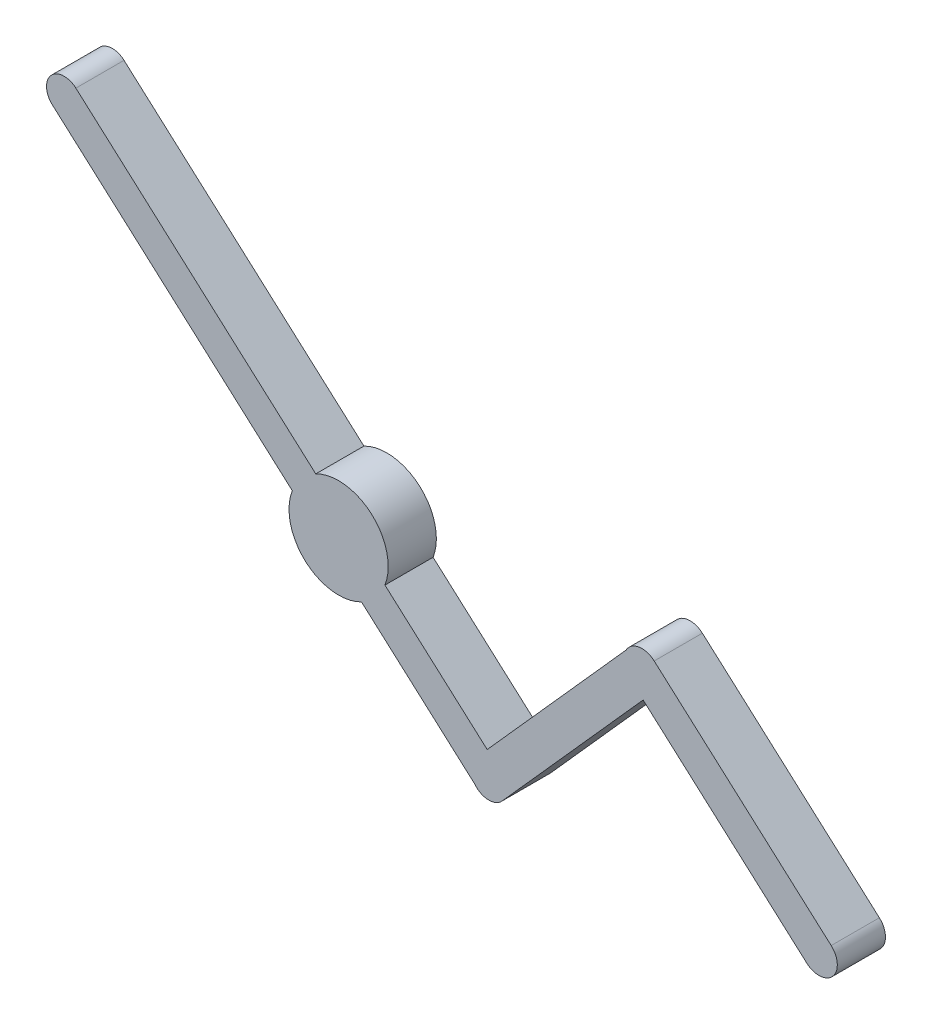
ISO-10303-21;
HEADER;
FILE_DESCRIPTION(('STEP AP214'),'2;1');
FILE_NAME('part.step','',(''),(''),'','','');
FILE_SCHEMA(('AUTOMOTIVE_DESIGN { 1 0 10303 214 1 1 1 1 }'));
ENDSEC;
DATA;
#1=APPLICATION_CONTEXT('core data for automotive mechanical design processes');
#2=APPLICATION_PROTOCOL_DEFINITION('international standard','automotive_design',2000,#1);
#3=PRODUCT_CONTEXT('',#1,'mechanical');
#4=PRODUCT('Part','Part','',(#3));
#5=PRODUCT_RELATED_PRODUCT_CATEGORY('part','',(#4));
#6=PRODUCT_DEFINITION_FORMATION('','',#4);
#7=PRODUCT_DEFINITION_CONTEXT('part definition',#1,'design');
#8=PRODUCT_DEFINITION('design','',#6,#7);
#9=PRODUCT_DEFINITION_SHAPE('','',#8);
#10=(LENGTH_UNIT() NAMED_UNIT(*) SI_UNIT(.MILLI.,.METRE.));
#11=(NAMED_UNIT(*) PLANE_ANGLE_UNIT() SI_UNIT($,.RADIAN.));
#12=(NAMED_UNIT(*) SI_UNIT($,.STERADIAN.) SOLID_ANGLE_UNIT());
#13=UNCERTAINTY_MEASURE_WITH_UNIT(LENGTH_MEASURE(1.E-05),#10,'distance_accuracy_value','');
#14=(GEOMETRIC_REPRESENTATION_CONTEXT(3) GLOBAL_UNCERTAINTY_ASSIGNED_CONTEXT((#13)) GLOBAL_UNIT_ASSIGNED_CONTEXT((#10,
#11,#12)) REPRESENTATION_CONTEXT('',''));
#15=CARTESIAN_POINT('',(0.,0.,0.));
#16=DIRECTION('',(0.,0.,1.));
#17=DIRECTION('',(1.,0.,0.));
#18=AXIS2_PLACEMENT_3D('',#15,#16,#17);
#19=CARTESIAN_POINT('',(144.167279134353,-128.666791198798,2.));
#20=DIRECTION('',(-0.746076463848962,0.665860278204541,0.));
#21=DIRECTION('',(-0.665860278204541,-0.746076463848962,0.));
#22=AXIS2_PLACEMENT_3D('',#19,#20,#21);
#23=PLANE('',#22);
#24=DIRECTION('',(0.665860278204541,0.746076463848962,0.));
#25=VECTOR('',#24,1.);
#26=CARTESIAN_POINT('',(144.167279134353,-128.666791198798,0.));
#27=LINE('',#26,#25);
#28=CARTESIAN_POINT('',(197.074273983325,-69.3860908449162,0.));
#29=VERTEX_POINT('',#28);
#30=CARTESIAN_POINT('',(202.925750043493,-62.8296874819783,0.));
#31=VERTEX_POINT('',#30);
#32=EDGE_CURVE('E169',#29,#31,#27,.T.);
#33=ORIENTED_EDGE('',*,*,#32,.T.);
#34=DIRECTION('',(0.,0.,-1.));
#35=VECTOR('',#34,1.);
#36=CARTESIAN_POINT('',(202.925750043493,-62.8296874819783,2.));
#37=LINE('',#36,#35);
#38=CARTESIAN_POINT('',(202.925750043493,-62.8296874819783,2.));
#39=VERTEX_POINT('',#38);
#40=EDGE_CURVE('E11',#39,#31,#37,.T.);
#41=ORIENTED_EDGE('',*,*,#40,.F.);
#42=DIRECTION('',(0.665860278204541,0.746076463848962,0.));
#43=VECTOR('',#42,1.);
#44=CARTESIAN_POINT('',(144.167279134353,-128.666791198798,2.));
#45=LINE('',#44,#43);
#46=CARTESIAN_POINT('',(197.074273983325,-69.3860908449162,2.));
#47=VERTEX_POINT('',#46);
#48=EDGE_CURVE('E202',#47,#39,#45,.T.);
#49=ORIENTED_EDGE('',*,*,#48,.F.);
#50=DIRECTION('',(0.,0.,-1.));
#51=VECTOR('',#50,1.);
#52=CARTESIAN_POINT('',(197.074273983325,-69.3860908449162,2.));
#53=LINE('',#52,#51);
#54=EDGE_CURVE('E165',#47,#29,#53,.T.);
#55=ORIENTED_EDGE('',*,*,#54,.T.);
#56=EDGE_LOOP('',(#33,#41,#49,#55));
#57=FACE_BOUND('',#56,.T.);
#58=ADVANCED_FACE('F37',(#57),#23,.F.);
#59=CARTESIAN_POINT('',(58.7584709091406,65.8371037168205,2.));
#60=DIRECTION('',(0.665860278204545,0.746076463848959,0.));
#61=DIRECTION('',(-0.746076463848959,0.665860278204545,0.));
#62=AXIS2_PLACEMENT_3D('',#59,#60,#61);
#63=PLANE('',#62);
#64=DIRECTION('',(0.746076463848959,-0.665860278204544,0.));
#65=VECTOR('',#64,1.);
#66=CARTESIAN_POINT('',(58.7584709091406,65.8371037168205,0.));
#67=LINE('',#66,#65);
#68=CARTESIAN_POINT('',(209.719946290777,-68.8933895589126,0.));
#69=VERTEX_POINT('',#68);
#70=EDGE_CURVE('E172',#31,#69,#67,.T.);
#71=ORIENTED_EDGE('',*,*,#70,.T.);
#72=DIRECTION('',(0.,0.,-1.));
#73=VECTOR('',#72,1.);
#74=CARTESIAN_POINT('',(209.719946290777,-68.8933895589126,2.));
#75=LINE('',#74,#73);
#76=CARTESIAN_POINT('',(209.719946290777,-68.8933895589126,2.));
#77=VERTEX_POINT('',#76);
#78=EDGE_CURVE('E45',#77,#69,#75,.T.);
#79=ORIENTED_EDGE('',*,*,#78,.F.);
#80=DIRECTION('',(0.746076463848959,-0.665860278204544,0.));
#81=VECTOR('',#80,1.);
#82=CARTESIAN_POINT('',(58.7584709091406,65.8371037168205,2.));
#83=LINE('',#82,#81);
#84=EDGE_CURVE('E114',#39,#77,#83,.T.);
#85=ORIENTED_EDGE('',*,*,#84,.F.);
#86=ORIENTED_EDGE('',*,*,#40,.T.);
#87=EDGE_LOOP('',(#71,#79,#85,#86));
#88=FACE_BOUND('',#87,.T.);
#89=ADVANCED_FACE('F281',(#88),#63,.F.);
#90=CARTESIAN_POINT('',(210.227354136381,-68.3248542917263,2.));
#91=DIRECTION('',(0.,0.,-1.));
#92=DIRECTION('',(-1.,0.,0.));
#93=AXIS2_PLACEMENT_3D('',#90,#91,#92);
#94=CYLINDRICAL_SURFACE('',#93,0.762033510953083);
#95=CARTESIAN_POINT('',(210.227354136381,-68.3248542917263,0.));
#96=DIRECTION('',(0.,0.,1.));
#97=DIRECTION('',(1.,0.,0.));
#98=AXIS2_PLACEMENT_3D('',#95,#96,#97);
#99=CIRCLE('',#98,0.762033510953083);
#100=CARTESIAN_POINT('',(210.734761981986,-67.75631902454,0.));
#101=VERTEX_POINT('',#100);
#102=EDGE_CURVE('E174',#69,#101,#99,.T.);
#103=ORIENTED_EDGE('',*,*,#102,.T.);
#104=DIRECTION('',(0.,0.,-1.));
#105=VECTOR('',#104,1.);
#106=CARTESIAN_POINT('',(210.734761981986,-67.75631902454,2.));
#107=LINE('',#106,#105);
#108=CARTESIAN_POINT('',(210.734761981986,-67.75631902454,2.));
#109=VERTEX_POINT('',#108);
#110=EDGE_CURVE('E221',#109,#101,#107,.T.);
#111=ORIENTED_EDGE('',*,*,#110,.F.);
#112=CARTESIAN_POINT('',(210.227354136381,-68.3248542917263,2.));
#113=DIRECTION('',(0.,0.,1.));
#114=DIRECTION('',(1.,0.,0.));
#115=AXIS2_PLACEMENT_3D('',#112,#113,#114);
#116=CIRCLE('',#115,0.762033510953083);
#117=EDGE_CURVE('E228',#77,#109,#116,.T.);
#118=ORIENTED_EDGE('',*,*,#117,.F.);
#119=ORIENTED_EDGE('',*,*,#78,.T.);
#120=EDGE_LOOP('',(#103,#111,#118,#119));
#121=FACE_BOUND('',#120,.T.);
#122=ADVANCED_FACE('F226',(#121),#94,.T.);
#123=CARTESIAN_POINT('',(59.7732866003492,66.974174251193,2.));
#124=DIRECTION('',(0.665860278204544,0.74607646384896,0.));
#125=DIRECTION('',(-0.74607646384896,0.665860278204544,0.));
#126=AXIS2_PLACEMENT_3D('',#123,#124,#125);
#127=PLANE('',#126);
#128=DIRECTION('',(0.74607646384896,-0.665860278204544,0.));
#129=VECTOR('',#128,1.);
#130=CARTESIAN_POINT('',(59.7732866003492,66.974174251193,0.));
#131=LINE('',#130,#129);
#132=CARTESIAN_POINT('',(203.385396716601,-61.1971382470234,0.));
#133=VERTEX_POINT('',#132);
#134=EDGE_CURVE('E177',#133,#101,#131,.T.);
#135=ORIENTED_EDGE('',*,*,#134,.F.);
#136=DIRECTION('',(0.,0.,-1.));
#137=VECTOR('',#136,1.);
#138=CARTESIAN_POINT('',(203.385396716601,-61.1971382470234,2.));
#139=LINE('',#138,#137);
#140=CARTESIAN_POINT('',(203.385396716601,-61.1971382470234,2.));
#141=VERTEX_POINT('',#140);
#142=EDGE_CURVE('E219',#141,#133,#139,.T.);
#143=ORIENTED_EDGE('',*,*,#142,.F.);
#144=DIRECTION('',(0.74607646384896,-0.665860278204544,0.));
#145=VECTOR('',#144,1.);
#146=CARTESIAN_POINT('',(59.7732866003492,66.974174251193,2.));
#147=LINE('',#146,#145);
#148=EDGE_CURVE('E239',#141,#109,#147,.T.);
#149=ORIENTED_EDGE('',*,*,#148,.T.);
#150=ORIENTED_EDGE('',*,*,#110,.T.);
#151=EDGE_LOOP('',(#135,#143,#149,#150));
#152=FACE_BOUND('',#151,.T.);
#153=ADVANCED_FACE('F235',(#152),#127,.T.);
#154=CARTESIAN_POINT('',(202.877988870997,-61.7656735142097,2.));
#155=DIRECTION('',(0.,0.,-1.));
#156=DIRECTION('',(-1.,0.,0.));
#157=AXIS2_PLACEMENT_3D('',#154,#155,#156);
#158=CYLINDRICAL_SURFACE('',#157,0.762033510953078);
#159=CARTESIAN_POINT('',(202.877988870997,-61.7656735142097,0.));
#160=DIRECTION('',(0.,0.,1.));
#161=DIRECTION('',(1.,0.,0.));
#162=AXIS2_PLACEMENT_3D('',#159,#160,#161);
#163=CIRCLE('',#162,0.762033510953078);
#164=CARTESIAN_POINT('',(202.213441705855,-61.3927497457028,0.));
#165=VERTEX_POINT('',#164);
#166=EDGE_CURVE('E180',#133,#165,#163,.T.);
#167=ORIENTED_EDGE('',*,*,#166,.T.);
#168=DIRECTION('',(0.,0.,-1.));
#169=VECTOR('',#168,1.);
#170=CARTESIAN_POINT('',(202.213441705855,-61.3927497457028,2.));
#171=LINE('',#170,#169);
#172=CARTESIAN_POINT('',(202.213441705855,-61.3927497457028,2.));
#173=VERTEX_POINT('',#172);
#174=EDGE_CURVE('E217',#173,#165,#171,.T.);
#175=ORIENTED_EDGE('',*,*,#174,.F.);
#176=CARTESIAN_POINT('',(202.877988870997,-61.7656735142097,2.));
#177=DIRECTION('',(0.,0.,1.));
#178=DIRECTION('',(1.,0.,0.));
#179=AXIS2_PLACEMENT_3D('',#176,#177,#178);
#180=CIRCLE('',#179,0.762033510953078);
#181=EDGE_CURVE('E240',#141,#173,#180,.T.);
#182=ORIENTED_EDGE('',*,*,#181,.F.);
#183=ORIENTED_EDGE('',*,*,#142,.T.);
#184=EDGE_LOOP('',(#167,#175,#182,#183));
#185=FACE_BOUND('',#184,.T.);
#186=ADVANCED_FACE('F292',(#185),#158,.T.);
#187=CARTESIAN_POINT('',(143.056941098152,-127.675833797634,2.));
#188=DIRECTION('',(-0.746076463848961,0.665860278204543,0.));
#189=DIRECTION('',(-0.665860278204543,-0.746076463848961,0.));
#190=AXIS2_PLACEMENT_3D('',#187,#188,#189);
#191=PLANE('',#190);
#192=DIRECTION('',(0.665860278204543,0.746076463848961,0.));
#193=VECTOR('',#192,1.);
#194=CARTESIAN_POINT('',(143.056941098152,-127.675833797634,0.));
#195=LINE('',#194,#193);
#196=CARTESIAN_POINT('',(196.450966632524,-67.8494301731958,0.));
#197=VERTEX_POINT('',#196);
#198=EDGE_CURVE('E183',#197,#165,#195,.T.);
#199=ORIENTED_EDGE('',*,*,#198,.F.);
#200=DIRECTION('',(0.,0.,-1.));
#201=VECTOR('',#200,1.);
#202=CARTESIAN_POINT('',(196.450966632524,-67.8494301731958,2.));
#203=LINE('',#202,#201);
#204=CARTESIAN_POINT('',(196.450966632524,-67.8494301731958,2.));
#205=VERTEX_POINT('',#204);
#206=EDGE_CURVE('E215',#205,#197,#203,.T.);
#207=ORIENTED_EDGE('',*,*,#206,.F.);
#208=DIRECTION('',(0.665860278204543,0.746076463848961,0.));
#209=VECTOR('',#208,1.);
#210=CARTESIAN_POINT('',(143.056941098152,-127.675833797634,2.));
#211=LINE('',#210,#209);
#212=EDGE_CURVE('E242',#205,#173,#211,.T.);
#213=ORIENTED_EDGE('',*,*,#212,.T.);
#214=ORIENTED_EDGE('',*,*,#174,.T.);
#215=EDGE_LOOP('',(#199,#207,#213,#214));
#216=FACE_BOUND('',#215,.T.);
#217=ADVANCED_FACE('F295',(#216),#191,.T.);
#218=CARTESIAN_POINT('',(53.3940255343725,59.8264036244382,2.));
#219=DIRECTION('',(0.665860278204543,0.74607646384896,0.));
#220=DIRECTION('',(-0.74607646384896,0.665860278204543,0.));
#221=AXIS2_PLACEMENT_3D('',#218,#219,#220);
#222=PLANE('',#221);
#223=DIRECTION('',(0.74607646384896,-0.665860278204543,0.));
#224=VECTOR('',#223,1.);
#225=CARTESIAN_POINT('',(53.3940255343725,59.8264036244382,0.));
#226=LINE('',#225,#224);
#227=CARTESIAN_POINT('',(192.204166739987,-64.0592350726353,0.));
#228=VERTEX_POINT('',#227);
#229=EDGE_CURVE('E186',#228,#197,#226,.T.);
#230=ORIENTED_EDGE('',*,*,#229,.F.);
#231=DIRECTION('',(0.,0.,-1.));
#232=VECTOR('',#231,1.);
#233=CARTESIAN_POINT('',(192.204166739987,-64.0592350726353,2.));
#234=LINE('',#233,#232);
#235=CARTESIAN_POINT('',(192.204166739987,-64.0592350726353,2.));
#236=VERTEX_POINT('',#235);
#237=EDGE_CURVE('E213',#236,#228,#234,.T.);
#238=ORIENTED_EDGE('',*,*,#237,.F.);
#239=DIRECTION('',(0.74607646384896,-0.665860278204543,0.));
#240=VECTOR('',#239,1.);
#241=CARTESIAN_POINT('',(53.3940255343725,59.8264036244382,2.));
#242=LINE('',#241,#240);
#243=EDGE_CURVE('E249',#236,#205,#242,.T.);
#244=ORIENTED_EDGE('',*,*,#243,.T.);
#245=ORIENTED_EDGE('',*,*,#206,.T.);
#246=EDGE_LOOP('',(#230,#238,#244,#245));
#247=FACE_BOUND('',#246,.T.);
#248=ADVANCED_FACE('F299',(#247),#222,.T.);
#249=CARTESIAN_POINT('',(190.281006735768,-63.3232178840935,2.));
#250=DIRECTION('',(0.,0.,-1.));
#251=DIRECTION('',(-1.,0.,0.));
#252=AXIS2_PLACEMENT_3D('',#249,#250,#251);
#253=CYLINDRICAL_SURFACE('',#252,2.05919054573817);
#254=CARTESIAN_POINT('',(190.281006735768,-63.3232178840935,0.));
#255=DIRECTION('',(0.,0.,1.));
#256=DIRECTION('',(1.,0.,0.));
#257=AXIS2_PLACEMENT_3D('',#254,#255,#256);
#258=CIRCLE('',#257,2.05919054573817);
#259=CARTESIAN_POINT('',(189.33190810235,-61.49579415444,0.));
#260=VERTEX_POINT('',#259);
#261=EDGE_CURVE('E189',#228,#260,#258,.T.);
#262=ORIENTED_EDGE('',*,*,#261,.T.);
#263=DIRECTION('',(0.,0.,-1.));
#264=VECTOR('',#263,1.);
#265=CARTESIAN_POINT('',(189.33190810235,-61.49579415444,2.));
#266=LINE('',#265,#264);
#267=CARTESIAN_POINT('',(189.33190810235,-61.49579415444,2.));
#268=VERTEX_POINT('',#267);
#269=EDGE_CURVE('E211',#268,#260,#266,.T.);
#270=ORIENTED_EDGE('',*,*,#269,.F.);
#271=CARTESIAN_POINT('',(190.281006735768,-63.3232178840935,2.));
#272=DIRECTION('',(0.,0.,1.));
#273=DIRECTION('',(1.,0.,0.));
#274=AXIS2_PLACEMENT_3D('',#271,#272,#273);
#275=CIRCLE('',#274,2.05919054573817);
#276=EDGE_CURVE('E252',#236,#268,#275,.T.);
#277=ORIENTED_EDGE('',*,*,#276,.F.);
#278=ORIENTED_EDGE('',*,*,#237,.T.);
#279=EDGE_LOOP('',(#262,#270,#277,#278));
#280=FACE_BOUND('',#279,.T.);
#281=ADVANCED_FACE('F303',(#280),#253,.T.);
#282=CARTESIAN_POINT('',(53.3940255343725,59.8264036244382,2.));
#283=DIRECTION('',(0.665860278204543,0.74607646384896,0.));
#284=DIRECTION('',(-0.74607646384896,0.665860278204543,0.));
#285=AXIS2_PLACEMENT_3D('',#282,#283,#284);
#286=PLANE('',#285);
#287=DIRECTION('',(0.74607646384896,-0.665860278204543,0.));
#288=VECTOR('',#287,1.);
#289=CARTESIAN_POINT('',(53.3940255343725,59.8264036244382,0.));
#290=LINE('',#289,#288);
#291=CARTESIAN_POINT('',(179.370166114003,-52.6051125511868,0.));
#292=VERTEX_POINT('',#291);
#293=EDGE_CURVE('E192',#292,#260,#290,.T.);
#294=ORIENTED_EDGE('',*,*,#293,.F.);
#295=DIRECTION('',(0.,0.,-1.));
#296=VECTOR('',#295,1.);
#297=CARTESIAN_POINT('',(179.370166114003,-52.6051125511868,2.));
#298=LINE('',#297,#296);
#299=CARTESIAN_POINT('',(179.370166114003,-52.6051125511868,2.));
#300=VERTEX_POINT('',#299);
#301=EDGE_CURVE('E209',#300,#292,#298,.T.);
#302=ORIENTED_EDGE('',*,*,#301,.F.);
#303=DIRECTION('',(0.74607646384896,-0.665860278204543,0.));
#304=VECTOR('',#303,1.);
#305=CARTESIAN_POINT('',(53.3940255343725,59.8264036244382,2.));
#306=LINE('',#305,#304);
#307=EDGE_CURVE('E254',#300,#268,#306,.T.);
#308=ORIENTED_EDGE('',*,*,#307,.T.);
#309=ORIENTED_EDGE('',*,*,#269,.T.);
#310=EDGE_LOOP('',(#294,#302,#308,#309));
#311=FACE_BOUND('',#310,.T.);
#312=ADVANCED_FACE('F307',(#311),#286,.T.);
#313=CARTESIAN_POINT('',(178.883135428603,-53.1508158217426,2.));
#314=DIRECTION('',(0.,0.,-1.));
#315=DIRECTION('',(-1.,0.,0.));
#316=AXIS2_PLACEMENT_3D('',#313,#314,#315);
#317=CYLINDRICAL_SURFACE('',#316,0.73143075408193);
#318=CARTESIAN_POINT('',(178.883135428603,-53.1508158217426,0.));
#319=DIRECTION('',(0.,0.,1.));
#320=DIRECTION('',(1.,0.,0.));
#321=AXIS2_PLACEMENT_3D('',#318,#319,#320);
#322=CIRCLE('',#321,0.73143075408193);
#323=CARTESIAN_POINT('',(178.396104743202,-53.6965190922984,0.));
#324=VERTEX_POINT('',#323);
#325=EDGE_CURVE('E195',#292,#324,#322,.T.);
#326=ORIENTED_EDGE('',*,*,#325,.T.);
#327=DIRECTION('',(0.,0.,-1.));
#328=VECTOR('',#327,1.);
#329=CARTESIAN_POINT('',(178.396104743202,-53.6965190922984,2.));
#330=LINE('',#329,#328);
#331=CARTESIAN_POINT('',(178.396104743202,-53.6965190922984,2.));
#332=VERTEX_POINT('',#331);
#333=EDGE_CURVE('E206',#332,#324,#330,.T.);
#334=ORIENTED_EDGE('',*,*,#333,.F.);
#335=CARTESIAN_POINT('',(178.883135428603,-53.1508158217426,2.));
#336=DIRECTION('',(0.,0.,1.));
#337=DIRECTION('',(1.,0.,0.));
#338=AXIS2_PLACEMENT_3D('',#335,#336,#337);
#339=CIRCLE('',#338,0.73143075408193);
#340=EDGE_CURVE('E257',#300,#332,#339,.T.);
#341=ORIENTED_EDGE('',*,*,#340,.F.);
#342=ORIENTED_EDGE('',*,*,#301,.T.);
#343=EDGE_LOOP('',(#326,#334,#341,#342));
#344=FACE_BOUND('',#343,.T.);
#345=ADVANCED_FACE('F262',(#344),#317,.T.);
#346=CARTESIAN_POINT('',(52.4199641635717,58.7349970833265,2.));
#347=DIRECTION('',(0.665860278204542,0.746076463848961,0.));
#348=DIRECTION('',(-0.746076463848961,0.665860278204542,0.));
#349=AXIS2_PLACEMENT_3D('',#346,#347,#348);
#350=PLANE('',#349);
#351=DIRECTION('',(0.746076463848961,-0.665860278204542,0.));
#352=VECTOR('',#351,1.);
#353=CARTESIAN_POINT('',(52.4199641635717,58.7349970833265,0.));
#354=LINE('',#353,#352);
#355=CARTESIAN_POINT('',(188.357846731549,-62.5872006955517,0.));
#356=VERTEX_POINT('',#355);
#357=EDGE_CURVE('E197',#324,#356,#354,.T.);
#358=ORIENTED_EDGE('',*,*,#357,.T.);
#359=DIRECTION('',(0.,0.,-1.));
#360=VECTOR('',#359,1.);
#361=CARTESIAN_POINT('',(188.357846731549,-62.5872006955517,2.));
#362=LINE('',#361,#360);
#363=CARTESIAN_POINT('',(188.357846731549,-62.5872006955517,2.));
#364=VERTEX_POINT('',#363);
#365=EDGE_CURVE('E160',#364,#356,#362,.T.);
#366=ORIENTED_EDGE('',*,*,#365,.F.);
#367=DIRECTION('',(0.746076463848961,-0.665860278204542,0.));
#368=VECTOR('',#367,1.);
#369=CARTESIAN_POINT('',(52.4199641635717,58.7349970833265,2.));
#370=LINE('',#369,#368);
#371=EDGE_CURVE('E151',#332,#364,#370,.T.);
#372=ORIENTED_EDGE('',*,*,#371,.F.);
#373=ORIENTED_EDGE('',*,*,#333,.T.);
#374=EDGE_LOOP('',(#358,#366,#372,#373));
#375=FACE_BOUND('',#374,.T.);
#376=ADVANCED_FACE('F266',(#375),#350,.F.);
#377=CARTESIAN_POINT('',(190.281006735768,-63.3232178840935,2.));
#378=DIRECTION('',(0.,0.,-1.));
#379=DIRECTION('',(-1.,0.,0.));
#380=AXIS2_PLACEMENT_3D('',#377,#378,#379);
#381=CYLINDRICAL_SURFACE('',#380,2.05919054573817);
#382=CARTESIAN_POINT('',(190.281006735768,-63.3232178840935,0.));
#383=DIRECTION('',(0.,0.,1.));
#384=DIRECTION('',(1.,0.,0.));
#385=AXIS2_PLACEMENT_3D('',#382,#383,#384);
#386=CIRCLE('',#385,2.05919054573817);
#387=CARTESIAN_POINT('',(191.230105369187,-65.150641613747,0.));
#388=VERTEX_POINT('',#387);
#389=EDGE_CURVE('E159',#356,#388,#386,.T.);
#390=ORIENTED_EDGE('',*,*,#389,.T.);
#391=DIRECTION('',(0.,0.,-1.));
#392=VECTOR('',#391,1.);
#393=CARTESIAN_POINT('',(191.230105369187,-65.150641613747,2.));
#394=LINE('',#393,#392);
#395=CARTESIAN_POINT('',(191.230105369187,-65.150641613747,2.));
#396=VERTEX_POINT('',#395);
#397=EDGE_CURVE('E156',#396,#388,#394,.T.);
#398=ORIENTED_EDGE('',*,*,#397,.F.);
#399=CARTESIAN_POINT('',(190.281006735768,-63.3232178840935,2.));
#400=DIRECTION('',(0.,0.,1.));
#401=DIRECTION('',(1.,0.,0.));
#402=AXIS2_PLACEMENT_3D('',#399,#400,#401);
#403=CIRCLE('',#402,2.05919054573817);
#404=EDGE_CURVE('E145',#364,#396,#403,.T.);
#405=ORIENTED_EDGE('',*,*,#404,.F.);
#406=ORIENTED_EDGE('',*,*,#365,.T.);
#407=EDGE_LOOP('',(#390,#398,#405,#406));
#408=FACE_BOUND('',#407,.T.);
#409=ADVANCED_FACE('F157',(#408),#381,.T.);
#410=CARTESIAN_POINT('',(52.4199641635717,58.7349970833265,2.));
#411=DIRECTION('',(0.665860278204542,0.746076463848961,0.));
#412=DIRECTION('',(-0.746076463848961,0.665860278204542,0.));
#413=AXIS2_PLACEMENT_3D('',#410,#411,#412);
#414=PLANE('',#413);
#415=DIRECTION('',(0.746076463848961,-0.665860278204542,0.));
#416=VECTOR('',#415,1.);
#417=CARTESIAN_POINT('',(52.4199641635717,58.7349970833265,0.));
#418=LINE('',#417,#416);
#419=CARTESIAN_POINT('',(195.929993041767,-69.3452096839548,0.));
#420=VERTEX_POINT('',#419);
#421=EDGE_CURVE('E100',#388,#420,#418,.T.);
#422=ORIENTED_EDGE('',*,*,#421,.T.);
#423=DIRECTION('',(0.,0.,-1.));
#424=VECTOR('',#423,1.);
#425=CARTESIAN_POINT('',(195.929993041767,-69.3452096839548,2.));
#426=LINE('',#425,#424);
#427=CARTESIAN_POINT('',(195.929993041767,-69.3452096839548,2.));
#428=VERTEX_POINT('',#427);
#429=EDGE_CURVE('E161',#428,#420,#426,.T.);
#430=ORIENTED_EDGE('',*,*,#429,.F.);
#431=DIRECTION('',(0.746076463848961,-0.665860278204542,0.));
#432=VECTOR('',#431,1.);
#433=CARTESIAN_POINT('',(52.4199641635717,58.7349970833265,2.));
#434=LINE('',#433,#432);
#435=EDGE_CURVE('E149',#396,#428,#434,.T.);
#436=ORIENTED_EDGE('',*,*,#435,.F.);
#437=ORIENTED_EDGE('',*,*,#397,.T.);
#438=EDGE_LOOP('',(#422,#430,#436,#437));
#439=FACE_BOUND('',#438,.T.);
#440=ADVANCED_FACE('F163',(#439),#414,.F.);
#441=CARTESIAN_POINT('',(196.519104965224,-68.8906121443339,2.));
#442=DIRECTION('',(0.,0.,-1.));
#443=DIRECTION('',(-1.,0.,0.));
#444=AXIS2_PLACEMENT_3D('',#441,#442,#443);
#445=CYLINDRICAL_SURFACE('',#444,0.744118123277038);
#446=CARTESIAN_POINT('',(196.519104965224,-68.8906121443339,0.));
#447=DIRECTION('',(0.,0.,1.));
#448=DIRECTION('',(1.,0.,0.));
#449=AXIS2_PLACEMENT_3D('',#446,#447,#448);
#450=CIRCLE('',#449,0.744118123277038);
#451=EDGE_CURVE('E106',#420,#29,#450,.T.);
#452=ORIENTED_EDGE('',*,*,#451,.T.);
#453=ORIENTED_EDGE('',*,*,#54,.F.);
#454=CARTESIAN_POINT('',(196.519104965224,-68.8906121443339,2.));
#455=DIRECTION('',(0.,0.,1.));
#456=DIRECTION('',(1.,0.,0.));
#457=AXIS2_PLACEMENT_3D('',#454,#455,#456);
#458=CIRCLE('',#457,0.744118123277038);
#459=EDGE_CURVE('E53',#428,#47,#458,.T.);
#460=ORIENTED_EDGE('',*,*,#459,.F.);
#461=ORIENTED_EDGE('',*,*,#429,.T.);
#462=EDGE_LOOP('',(#452,#453,#460,#461));
#463=FACE_BOUND('',#462,.T.);
#464=ADVANCED_FACE('F270',(#463),#445,.T.);
#465=CARTESIAN_POINT('',(0.,0.,2.));
#466=DIRECTION('',(0.,0.,1.));
#467=DIRECTION('',(1.,0.,0.));
#468=AXIS2_PLACEMENT_3D('',#465,#466,#467);
#469=PLANE('',#468);
#470=ORIENTED_EDGE('',*,*,#48,.T.);
#471=ORIENTED_EDGE('',*,*,#84,.T.);
#472=ORIENTED_EDGE('',*,*,#117,.T.);
#473=ORIENTED_EDGE('',*,*,#148,.F.);
#474=ORIENTED_EDGE('',*,*,#181,.T.);
#475=ORIENTED_EDGE('',*,*,#212,.F.);
#476=ORIENTED_EDGE('',*,*,#243,.F.);
#477=ORIENTED_EDGE('',*,*,#276,.T.);
#478=ORIENTED_EDGE('',*,*,#307,.F.);
#479=ORIENTED_EDGE('',*,*,#340,.T.);
#480=ORIENTED_EDGE('',*,*,#371,.T.);
#481=ORIENTED_EDGE('',*,*,#404,.T.);
#482=ORIENTED_EDGE('',*,*,#435,.T.);
#483=ORIENTED_EDGE('',*,*,#459,.T.);
#484=EDGE_LOOP('',(#470,#471,#472,#473,#474,#475,#476,#477,#478,#479,#480,#481,#482,#483));
#485=FACE_BOUND('',#484,.T.);
#486=ADVANCED_FACE('F147',(#485),#469,.T.);
#487=CARTESIAN_POINT('',(0.,0.,0.));
#488=DIRECTION('',(0.,0.,1.));
#489=DIRECTION('',(1.,0.,0.));
#490=AXIS2_PLACEMENT_3D('',#487,#488,#489);
#491=PLANE('',#490);
#492=ORIENTED_EDGE('',*,*,#32,.F.);
#493=ORIENTED_EDGE('',*,*,#451,.F.);
#494=ORIENTED_EDGE('',*,*,#421,.F.);
#495=ORIENTED_EDGE('',*,*,#389,.F.);
#496=ORIENTED_EDGE('',*,*,#357,.F.);
#497=ORIENTED_EDGE('',*,*,#325,.F.);
#498=ORIENTED_EDGE('',*,*,#293,.T.);
#499=ORIENTED_EDGE('',*,*,#261,.F.);
#500=ORIENTED_EDGE('',*,*,#229,.T.);
#501=ORIENTED_EDGE('',*,*,#198,.T.);
#502=ORIENTED_EDGE('',*,*,#166,.F.);
#503=ORIENTED_EDGE('',*,*,#134,.T.);
#504=ORIENTED_EDGE('',*,*,#102,.F.);
#505=ORIENTED_EDGE('',*,*,#70,.F.);
#506=EDGE_LOOP('',(#492,#493,#494,#495,#496,#497,#498,#499,#500,#501,#502,#503,#504,#505));
#507=FACE_BOUND('',#506,.T.);
#508=ADVANCED_FACE('F231',(#507),#491,.F.);
#509=CLOSED_SHELL('',(#58,#89,#122,#153,#186,#217,#248,#281,#312,#345,#376,#409,#440,#464,#486,#508));
#510=MANIFOLD_SOLID_BREP('B2',#509);
#511=ADVANCED_BREP_SHAPE_REPRESENTATION('',(#18,#510),#14);
#512=SHAPE_DEFINITION_REPRESENTATION(#9,#511);
ENDSEC;
END-ISO-10303-21;
